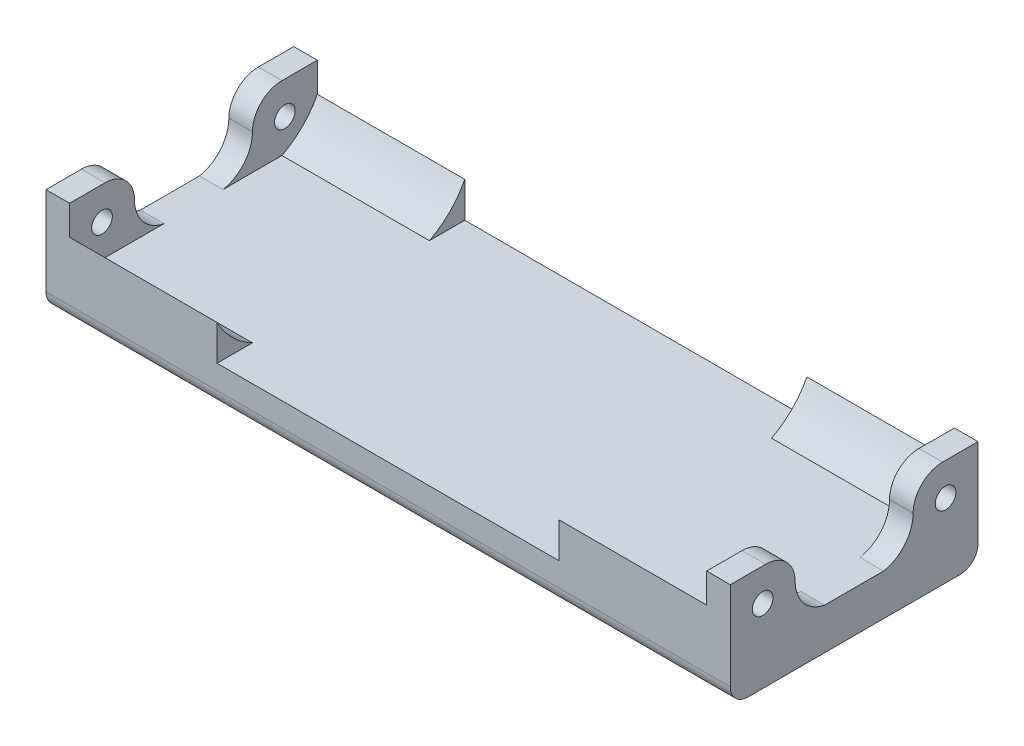
ISO-10303-21;
HEADER;
FILE_DESCRIPTION(('STEP AP214'),'2;1');
FILE_NAME('part.step','',(''),(''),'','','');
FILE_SCHEMA(('AUTOMOTIVE_DESIGN { 1 0 10303 214 1 1 1 1 }'));
ENDSEC;
DATA;
#1=APPLICATION_CONTEXT('core data for automotive mechanical design processes');
#2=APPLICATION_PROTOCOL_DEFINITION('international standard','automotive_design',2000,#1);
#3=PRODUCT_CONTEXT('',#1,'mechanical');
#4=PRODUCT('Part','Part','',(#3));
#5=PRODUCT_RELATED_PRODUCT_CATEGORY('part','',(#4));
#6=PRODUCT_DEFINITION_FORMATION('','',#4);
#7=PRODUCT_DEFINITION_CONTEXT('part definition',#1,'design');
#8=PRODUCT_DEFINITION('design','',#6,#7);
#9=PRODUCT_DEFINITION_SHAPE('','',#8);
#10=(LENGTH_UNIT() NAMED_UNIT(*) SI_UNIT(.MILLI.,.METRE.));
#11=(NAMED_UNIT(*) PLANE_ANGLE_UNIT() SI_UNIT($,.RADIAN.));
#12=(NAMED_UNIT(*) SI_UNIT($,.STERADIAN.) SOLID_ANGLE_UNIT());
#13=UNCERTAINTY_MEASURE_WITH_UNIT(LENGTH_MEASURE(1.E-05),#10,'distance_accuracy_value','');
#14=(GEOMETRIC_REPRESENTATION_CONTEXT(3) GLOBAL_UNCERTAINTY_ASSIGNED_CONTEXT((#13)) GLOBAL_UNIT_ASSIGNED_CONTEXT((#10,
#11,#12)) REPRESENTATION_CONTEXT('',''));
#15=CARTESIAN_POINT('',(0.,0.,0.));
#16=DIRECTION('',(0.,0.,1.));
#17=DIRECTION('',(1.,0.,0.));
#18=AXIS2_PLACEMENT_3D('',#15,#16,#17);
#19=CARTESIAN_POINT('',(0.,7.,0.));
#20=DIRECTION('',(0.,-1.,0.));
#21=DIRECTION('',(0.,0.,-1.));
#22=AXIS2_PLACEMENT_3D('',#19,#20,#21);
#23=PLANE('',#22);
#24=DIRECTION('',(0.,0.,-1.));
#25=VECTOR('',#24,1.);
#26=CARTESIAN_POINT('',(54.,7.,0.));
#27=LINE('',#26,#25);
#28=CARTESIAN_POINT('',(54.,7.,-4.99999999999997));
#29=VERTEX_POINT('',#28);
#30=CARTESIAN_POINT('',(54.,7.,-15.));
#31=VERTEX_POINT('',#30);
#32=EDGE_CURVE('E339',#29,#31,#27,.T.);
#33=ORIENTED_EDGE('',*,*,#32,.T.);
#34=DIRECTION('',(1.,0.,0.));
#35=VECTOR('',#34,1.);
#36=CARTESIAN_POINT('',(29.,7.,-15.));
#37=LINE('',#36,#35);
#38=CARTESIAN_POINT('',(29.,7.,-15.));
#39=VERTEX_POINT('',#38);
#40=EDGE_CURVE('E249',#39,#31,#37,.T.);
#41=ORIENTED_EDGE('',*,*,#40,.F.);
#42=DIRECTION('',(0.,0.,-1.));
#43=VECTOR('',#42,1.);
#44=CARTESIAN_POINT('',(29.,7.,-21.));
#45=LINE('',#44,#43);
#46=CARTESIAN_POINT('',(29.,7.,-21.));
#47=VERTEX_POINT('',#46);
#48=EDGE_CURVE('E255',#39,#47,#45,.T.);
#49=ORIENTED_EDGE('',*,*,#48,.T.);
#50=DIRECTION('',(1.,0.,0.));
#51=VECTOR('',#50,1.);
#52=CARTESIAN_POINT('',(-54.,7.,-21.));
#53=LINE('',#52,#51);
#54=CARTESIAN_POINT('',(-29.,7.,-21.));
#55=VERTEX_POINT('',#54);
#56=EDGE_CURVE('E262',#55,#47,#53,.T.);
#57=ORIENTED_EDGE('',*,*,#56,.F.);
#58=DIRECTION('',(0.,0.,-1.));
#59=VECTOR('',#58,1.);
#60=CARTESIAN_POINT('',(-29.,7.,-21.));
#61=LINE('',#60,#59);
#62=CARTESIAN_POINT('',(-29.,7.,-15.));
#63=VERTEX_POINT('',#62);
#64=EDGE_CURVE('E295',#63,#55,#61,.T.);
#65=ORIENTED_EDGE('',*,*,#64,.F.);
#66=DIRECTION('',(-1.,0.,0.));
#67=VECTOR('',#66,1.);
#68=CARTESIAN_POINT('',(-29.,7.,-15.));
#69=LINE('',#68,#67);
#70=CARTESIAN_POINT('',(-54.,7.,-15.));
#71=VERTEX_POINT('',#70);
#72=EDGE_CURVE('E283',#63,#71,#69,.T.);
#73=ORIENTED_EDGE('',*,*,#72,.T.);
#74=DIRECTION('',(0.,0.,-1.));
#75=VECTOR('',#74,1.);
#76=CARTESIAN_POINT('',(-54.,7.,0.));
#77=LINE('',#76,#75);
#78=CARTESIAN_POINT('',(-54.,7.,-4.99999999999997));
#79=VERTEX_POINT('',#78);
#80=EDGE_CURVE('E322',#79,#71,#77,.T.);
#81=ORIENTED_EDGE('',*,*,#80,.F.);
#82=DIRECTION('',(-1.,0.,0.));
#83=VECTOR('',#82,1.);
#84=CARTESIAN_POINT('',(77.4164878389476,7.,-4.99999999999997));
#85=LINE('',#84,#83);
#86=CARTESIAN_POINT('',(-58.,7.,-4.99999999999997));
#87=VERTEX_POINT('',#86);
#88=EDGE_CURVE('E447',#79,#87,#85,.T.);
#89=ORIENTED_EDGE('',*,*,#88,.T.);
#90=DIRECTION('',(0.,0.,1.));
#91=VECTOR('',#90,1.);
#92=CARTESIAN_POINT('',(-58.,7.,21.));
#93=LINE('',#92,#91);
#94=CARTESIAN_POINT('',(-58.,7.,4.99999999999998));
#95=VERTEX_POINT('',#94);
#96=EDGE_CURVE('E459',#87,#95,#93,.T.);
#97=ORIENTED_EDGE('',*,*,#96,.T.);
#98=DIRECTION('',(-1.,0.,0.));
#99=VECTOR('',#98,1.);
#100=CARTESIAN_POINT('',(77.4164878389476,7.,4.99999999999997));
#101=LINE('',#100,#99);
#102=CARTESIAN_POINT('',(-54.,7.,4.99999999999997));
#103=VERTEX_POINT('',#102);
#104=EDGE_CURVE('E403',#103,#95,#101,.T.);
#105=ORIENTED_EDGE('',*,*,#104,.F.);
#106=DIRECTION('',(0.,0.,-1.));
#107=VECTOR('',#106,1.);
#108=CARTESIAN_POINT('',(-54.,7.,0.));
#109=LINE('',#108,#107);
#110=CARTESIAN_POINT('',(-54.,7.,15.));
#111=VERTEX_POINT('',#110);
#112=EDGE_CURVE('E360',#111,#103,#109,.T.);
#113=ORIENTED_EDGE('',*,*,#112,.F.);
#114=DIRECTION('',(-1.,0.,0.));
#115=VECTOR('',#114,1.);
#116=CARTESIAN_POINT('',(-29.,7.,15.));
#117=LINE('',#116,#115);
#118=CARTESIAN_POINT('',(-29.,7.,15.));
#119=VERTEX_POINT('',#118);
#120=EDGE_CURVE('E310',#119,#111,#117,.T.);
#121=ORIENTED_EDGE('',*,*,#120,.F.);
#122=DIRECTION('',(0.,0.,-1.));
#123=VECTOR('',#122,1.);
#124=CARTESIAN_POINT('',(-29.,7.,21.));
#125=LINE('',#124,#123);
#126=CARTESIAN_POINT('',(-29.,7.,21.));
#127=VERTEX_POINT('',#126);
#128=EDGE_CURVE('E302',#127,#119,#125,.T.);
#129=ORIENTED_EDGE('',*,*,#128,.F.);
#130=DIRECTION('',(1.,0.,0.));
#131=VECTOR('',#130,1.);
#132=CARTESIAN_POINT('',(-54.,7.,21.));
#133=LINE('',#132,#131);
#134=CARTESIAN_POINT('',(29.,7.,21.));
#135=VERTEX_POINT('',#134);
#136=EDGE_CURVE('E333',#127,#135,#133,.T.);
#137=ORIENTED_EDGE('',*,*,#136,.T.);
#138=DIRECTION('',(0.,0.,-1.));
#139=VECTOR('',#138,1.);
#140=CARTESIAN_POINT('',(29.,7.,21.));
#141=LINE('',#140,#139);
#142=CARTESIAN_POINT('',(29.,7.,15.));
#143=VERTEX_POINT('',#142);
#144=EDGE_CURVE('E273',#135,#143,#141,.T.);
#145=ORIENTED_EDGE('',*,*,#144,.T.);
#146=DIRECTION('',(1.,0.,0.));
#147=VECTOR('',#146,1.);
#148=CARTESIAN_POINT('',(29.,7.,15.));
#149=LINE('',#148,#147);
#150=CARTESIAN_POINT('',(54.,7.,15.));
#151=VERTEX_POINT('',#150);
#152=EDGE_CURVE('E276',#143,#151,#149,.T.);
#153=ORIENTED_EDGE('',*,*,#152,.T.);
#154=DIRECTION('',(0.,0.,-1.));
#155=VECTOR('',#154,1.);
#156=CARTESIAN_POINT('',(54.,7.,0.));
#157=LINE('',#156,#155);
#158=CARTESIAN_POINT('',(54.,7.,4.99999999999997));
#159=VERTEX_POINT('',#158);
#160=EDGE_CURVE('E373',#151,#159,#157,.T.);
#161=ORIENTED_EDGE('',*,*,#160,.T.);
#162=CARTESIAN_POINT('',(58.,7.,4.99999999999998));
#163=VERTEX_POINT('',#162);
#164=EDGE_CURVE('E404',#163,#159,#101,.T.);
#165=ORIENTED_EDGE('',*,*,#164,.F.);
#166=DIRECTION('',(0.,0.,-1.));
#167=VECTOR('',#166,1.);
#168=CARTESIAN_POINT('',(58.,7.,21.));
#169=LINE('',#168,#167);
#170=CARTESIAN_POINT('',(58.,7.,-4.99999999999997));
#171=VERTEX_POINT('',#170);
#172=EDGE_CURVE('E457',#163,#171,#169,.T.);
#173=ORIENTED_EDGE('',*,*,#172,.T.);
#174=EDGE_CURVE('E448',#171,#29,#85,.T.);
#175=ORIENTED_EDGE('',*,*,#174,.T.);
#176=EDGE_LOOP('',(#33,#41,#49,#57,#65,#73,#81,#89,#97,#105,#113,#121,#129,#137,#145,#153,#161,
#165,#173,#175));
#177=FACE_BOUND('',#176,.T.);
#178=ADVANCED_FACE('F40',(#177),#23,.F.);
#179=CARTESIAN_POINT('',(-54.,0.,0.));
#180=DIRECTION('',(1.,0.,0.));
#181=DIRECTION('',(0.,0.,-1.));
#182=AXIS2_PLACEMENT_3D('',#179,#180,#181);
#183=PLANE('',#182);
#184=CARTESIAN_POINT('',(-54.,12.4749999999999,-15.5));
#185=DIRECTION('',(1.,0.,0.));
#186=DIRECTION('',(0.,0.,-1.));
#187=AXIS2_PLACEMENT_3D('',#184,#185,#186);
#188=CIRCLE('',#187,1.74999999999998);
#189=CARTESIAN_POINT('',(-54.,12.4749999999999,-17.2499999999999));
#190=VERTEX_POINT('',#189);
#191=EDGE_CURVE('E313',#190,#190,#188,.T.);
#192=ORIENTED_EDGE('',*,*,#191,.F.);
#193=EDGE_LOOP('',(#192));
#194=FACE_BOUND('',#193,.T.);
#195=ORIENTED_EDGE('',*,*,#80,.T.);
#196=CARTESIAN_POINT('',(-54.,19.4339811320566,-8.5660188679434));
#197=DIRECTION('',(-1.,0.,0.));
#198=DIRECTION('',(0.,0.,-1.));
#199=AXIS2_PLACEMENT_3D('',#196,#197,#198);
#200=CIRCLE('',#199,14.);
#201=CARTESIAN_POINT('',(-54.,13.,-21.));
#202=VERTEX_POINT('',#201);
#203=EDGE_CURVE('E289',#202,#71,#200,.T.);
#204=ORIENTED_EDGE('',*,*,#203,.F.);
#205=DIRECTION('',(0.,1.,0.));
#206=VECTOR('',#205,1.);
#207=CARTESIAN_POINT('',(-54.,0.,-21.));
#208=LINE('',#207,#206);
#209=CARTESIAN_POINT('',(-54.,18.,-21.));
#210=VERTEX_POINT('',#209);
#211=EDGE_CURVE('E325',#202,#210,#208,.T.);
#212=ORIENTED_EDGE('',*,*,#211,.T.);
#213=DIRECTION('',(0.,0.,1.));
#214=VECTOR('',#213,1.);
#215=CARTESIAN_POINT('',(-54.,18.,0.));
#216=LINE('',#215,#214);
#217=CARTESIAN_POINT('',(-54.,18.,-15.));
#218=VERTEX_POINT('',#217);
#219=EDGE_CURVE('E327',#210,#218,#216,.T.);
#220=ORIENTED_EDGE('',*,*,#219,.T.);
#221=CARTESIAN_POINT('',(-54.,13.,-15.));
#222=DIRECTION('',(1.,0.,0.));
#223=DIRECTION('',(0.,0.,-1.));
#224=AXIS2_PLACEMENT_3D('',#221,#222,#223);
#225=CIRCLE('',#224,5.);
#226=CARTESIAN_POINT('',(-54.,13.,-10.));
#227=VERTEX_POINT('',#226);
#228=EDGE_CURVE('E316',#218,#227,#225,.T.);
#229=ORIENTED_EDGE('',*,*,#228,.T.);
#230=CARTESIAN_POINT('',(-54.,13.,-3.90000000000004));
#231=DIRECTION('',(1.,0.,0.));
#232=DIRECTION('',(0.,0.,-1.));
#233=AXIS2_PLACEMENT_3D('',#230,#231,#232);
#234=CIRCLE('',#233,6.09999999999996);
#235=EDGE_CURVE('E319',#227,#79,#234,.F.);
#236=ORIENTED_EDGE('',*,*,#235,.T.);
#237=EDGE_LOOP('',(#195,#204,#212,#220,#229,#236));
#238=FACE_BOUND('',#237,.T.);
#239=ADVANCED_FACE('F593',(#194,#238),#183,.T.);
#240=CARTESIAN_POINT('',(-54.,0.,0.));
#241=DIRECTION('',(1.,0.,0.));
#242=DIRECTION('',(0.,0.,-1.));
#243=AXIS2_PLACEMENT_3D('',#240,#241,#242);
#244=PLANE('',#243);
#245=CARTESIAN_POINT('',(-54.,12.4749999999999,15.5));
#246=DIRECTION('',(1.,0.,0.));
#247=DIRECTION('',(0.,0.,-1.));
#248=AXIS2_PLACEMENT_3D('',#245,#246,#247);
#249=CIRCLE('',#248,1.74999999999999);
#250=CARTESIAN_POINT('',(-54.,12.4749999999999,13.75));
#251=VERTEX_POINT('',#250);
#252=EDGE_CURVE('E348',#251,#251,#249,.T.);
#253=ORIENTED_EDGE('',*,*,#252,.F.);
#254=EDGE_LOOP('',(#253));
#255=FACE_BOUND('',#254,.T.);
#256=DIRECTION('',(0.,1.,0.));
#257=VECTOR('',#256,1.);
#258=CARTESIAN_POINT('',(-54.,0.,21.));
#259=LINE('',#258,#257);
#260=CARTESIAN_POINT('',(-54.,13.,21.));
#261=VERTEX_POINT('',#260);
#262=CARTESIAN_POINT('',(-54.,18.,21.));
#263=VERTEX_POINT('',#262);
#264=EDGE_CURVE('E358',#261,#263,#259,.T.);
#265=ORIENTED_EDGE('',*,*,#264,.F.);
#266=CARTESIAN_POINT('',(-54.,19.4339811320566,8.5660188679434));
#267=DIRECTION('',(-1.,0.,0.));
#268=DIRECTION('',(0.,0.,1.));
#269=AXIS2_PLACEMENT_3D('',#266,#267,#268);
#270=CIRCLE('',#269,14.);
#271=EDGE_CURVE('E292',#111,#261,#270,.T.);
#272=ORIENTED_EDGE('',*,*,#271,.F.);
#273=ORIENTED_EDGE('',*,*,#112,.T.);
#274=CARTESIAN_POINT('',(-54.,13.,3.90000000000004));
#275=DIRECTION('',(1.,0.,0.));
#276=DIRECTION('',(0.,0.,-1.));
#277=AXIS2_PLACEMENT_3D('',#274,#275,#276);
#278=CIRCLE('',#277,6.09999999999996);
#279=CARTESIAN_POINT('',(-54.,13.,10.));
#280=VERTEX_POINT('',#279);
#281=EDGE_CURVE('E362',#280,#103,#278,.T.);
#282=ORIENTED_EDGE('',*,*,#281,.F.);
#283=CARTESIAN_POINT('',(-54.,13.,15.));
#284=DIRECTION('',(1.,0.,0.));
#285=DIRECTION('',(0.,0.,-1.));
#286=AXIS2_PLACEMENT_3D('',#283,#284,#285);
#287=CIRCLE('',#286,5.);
#288=CARTESIAN_POINT('',(-54.,18.,15.));
#289=VERTEX_POINT('',#288);
#290=EDGE_CURVE('E351',#289,#280,#287,.F.);
#291=ORIENTED_EDGE('',*,*,#290,.F.);
#292=DIRECTION('',(0.,0.,-1.));
#293=VECTOR('',#292,1.);
#294=CARTESIAN_POINT('',(-54.,18.,0.));
#295=LINE('',#294,#293);
#296=EDGE_CURVE('E355',#263,#289,#295,.T.);
#297=ORIENTED_EDGE('',*,*,#296,.F.);
#298=EDGE_LOOP('',(#265,#272,#273,#282,#291,#297));
#299=FACE_BOUND('',#298,.T.);
#300=ADVANCED_FACE('F560',(#255,#299),#244,.T.);
#301=CARTESIAN_POINT('',(-58.,7.,-21.));
#302=DIRECTION('',(0.,0.,1.));
#303=DIRECTION('',(1.,0.,0.));
#304=AXIS2_PLACEMENT_3D('',#301,#302,#303);
#305=PLANE('',#304);
#306=DIRECTION('',(0.,-1.,0.));
#307=VECTOR('',#306,1.);
#308=CARTESIAN_POINT('',(58.,7.,-21.));
#309=LINE('',#308,#307);
#310=CARTESIAN_POINT('',(58.,18.,-21.));
#311=VERTEX_POINT('',#310);
#312=CARTESIAN_POINT('',(58.,3.,-21.));
#313=VERTEX_POINT('',#312);
#314=EDGE_CURVE('E475',#311,#313,#309,.T.);
#315=ORIENTED_EDGE('',*,*,#314,.T.);
#316=DIRECTION('',(-1.,0.,0.));
#317=VECTOR('',#316,1.);
#318=CARTESIAN_POINT('',(-58.,3.,-21.));
#319=LINE('',#318,#317);
#320=CARTESIAN_POINT('',(-58.,3.,-21.));
#321=VERTEX_POINT('',#320);
#322=EDGE_CURVE('E11',#313,#321,#319,.T.);
#323=ORIENTED_EDGE('',*,*,#322,.T.);
#324=DIRECTION('',(0.,-1.,0.));
#325=VECTOR('',#324,1.);
#326=CARTESIAN_POINT('',(-58.,7.,-21.));
#327=LINE('',#326,#325);
#328=CARTESIAN_POINT('',(-58.,18.,-21.));
#329=VERTEX_POINT('',#328);
#330=EDGE_CURVE('E472',#329,#321,#327,.T.);
#331=ORIENTED_EDGE('',*,*,#330,.F.);
#332=DIRECTION('',(-1.,0.,0.));
#333=VECTOR('',#332,1.);
#334=CARTESIAN_POINT('',(77.4164878389476,18.,-21.));
#335=LINE('',#334,#333);
#336=EDGE_CURVE('E443',#210,#329,#335,.T.);
#337=ORIENTED_EDGE('',*,*,#336,.F.);
#338=ORIENTED_EDGE('',*,*,#211,.F.);
#339=DIRECTION('',(-1.,0.,0.));
#340=VECTOR('',#339,1.);
#341=CARTESIAN_POINT('',(-29.,13.,-21.));
#342=LINE('',#341,#340);
#343=CARTESIAN_POINT('',(-29.,13.,-21.));
#344=VERTEX_POINT('',#343);
#345=EDGE_CURVE('E285',#344,#202,#342,.T.);
#346=ORIENTED_EDGE('',*,*,#345,.F.);
#347=DIRECTION('',(0.,1.,0.));
#348=VECTOR('',#347,1.);
#349=CARTESIAN_POINT('',(-29.,7.,-21.));
#350=LINE('',#349,#348);
#351=EDGE_CURVE('E288',#55,#344,#350,.T.);
#352=ORIENTED_EDGE('',*,*,#351,.F.);
#353=ORIENTED_EDGE('',*,*,#56,.T.);
#354=DIRECTION('',(0.,1.,0.));
#355=VECTOR('',#354,1.);
#356=CARTESIAN_POINT('',(29.,7.,-21.));
#357=LINE('',#356,#355);
#358=CARTESIAN_POINT('',(29.,13.,-21.));
#359=VERTEX_POINT('',#358);
#360=EDGE_CURVE('E253',#47,#359,#357,.T.);
#361=ORIENTED_EDGE('',*,*,#360,.T.);
#362=DIRECTION('',(1.,0.,0.));
#363=VECTOR('',#362,1.);
#364=CARTESIAN_POINT('',(29.,13.,-21.));
#365=LINE('',#364,#363);
#366=CARTESIAN_POINT('',(54.,13.,-21.));
#367=VERTEX_POINT('',#366);
#368=EDGE_CURVE('E238',#359,#367,#365,.T.);
#369=ORIENTED_EDGE('',*,*,#368,.T.);
#370=DIRECTION('',(0.,1.,0.));
#371=VECTOR('',#370,1.);
#372=CARTESIAN_POINT('',(54.,0.,-21.));
#373=LINE('',#372,#371);
#374=CARTESIAN_POINT('',(54.,18.,-21.));
#375=VERTEX_POINT('',#374);
#376=EDGE_CURVE('E342',#367,#375,#373,.T.);
#377=ORIENTED_EDGE('',*,*,#376,.T.);
#378=EDGE_CURVE('E444',#311,#375,#335,.T.);
#379=ORIENTED_EDGE('',*,*,#378,.F.);
#380=EDGE_LOOP('',(#315,#323,#331,#337,#338,#346,#352,#353,#361,#369,#377,#379));
#381=FACE_BOUND('',#380,.T.);
#382=ADVANCED_FACE('F260',(#381),#305,.F.);
#383=CARTESIAN_POINT('',(-58.,7.,21.));
#384=DIRECTION('',(0.,0.,-1.));
#385=DIRECTION('',(-1.,0.,0.));
#386=AXIS2_PLACEMENT_3D('',#383,#384,#385);
#387=PLANE('',#386);
#388=DIRECTION('',(0.,-1.,0.));
#389=VECTOR('',#388,1.);
#390=CARTESIAN_POINT('',(-58.,7.,21.));
#391=LINE('',#390,#389);
#392=CARTESIAN_POINT('',(-58.,18.,21.));
#393=VERTEX_POINT('',#392);
#394=CARTESIAN_POINT('',(-58.,3.,21.));
#395=VERTEX_POINT('',#394);
#396=EDGE_CURVE('E469',#393,#395,#391,.T.);
#397=ORIENTED_EDGE('',*,*,#396,.T.);
#398=DIRECTION('',(1.,0.,0.));
#399=VECTOR('',#398,1.);
#400=CARTESIAN_POINT('',(58.,3.,21.));
#401=LINE('',#400,#399);
#402=CARTESIAN_POINT('',(58.,3.,21.));
#403=VERTEX_POINT('',#402);
#404=EDGE_CURVE('E477',#395,#403,#401,.T.);
#405=ORIENTED_EDGE('',*,*,#404,.T.);
#406=DIRECTION('',(0.,-1.,0.));
#407=VECTOR('',#406,1.);
#408=CARTESIAN_POINT('',(58.,7.,21.));
#409=LINE('',#408,#407);
#410=CARTESIAN_POINT('',(58.,18.,21.));
#411=VERTEX_POINT('',#410);
#412=EDGE_CURVE('E463',#411,#403,#409,.T.);
#413=ORIENTED_EDGE('',*,*,#412,.F.);
#414=DIRECTION('',(-1.,0.,0.));
#415=VECTOR('',#414,1.);
#416=CARTESIAN_POINT('',(77.4164878389476,18.,21.));
#417=LINE('',#416,#415);
#418=CARTESIAN_POINT('',(54.,18.,21.));
#419=VERTEX_POINT('',#418);
#420=EDGE_CURVE('E400',#411,#419,#417,.T.);
#421=ORIENTED_EDGE('',*,*,#420,.T.);
#422=DIRECTION('',(0.,1.,0.));
#423=VECTOR('',#422,1.);
#424=CARTESIAN_POINT('',(54.,0.,21.));
#425=LINE('',#424,#423);
#426=CARTESIAN_POINT('',(54.,13.,21.));
#427=VERTEX_POINT('',#426);
#428=EDGE_CURVE('E371',#427,#419,#425,.T.);
#429=ORIENTED_EDGE('',*,*,#428,.F.);
#430=DIRECTION('',(1.,0.,0.));
#431=VECTOR('',#430,1.);
#432=CARTESIAN_POINT('',(29.,13.,21.));
#433=LINE('',#432,#431);
#434=CARTESIAN_POINT('',(29.,13.,21.));
#435=VERTEX_POINT('',#434);
#436=EDGE_CURVE('E281',#435,#427,#433,.T.);
#437=ORIENTED_EDGE('',*,*,#436,.F.);
#438=DIRECTION('',(0.,-1.,0.));
#439=VECTOR('',#438,1.);
#440=CARTESIAN_POINT('',(29.,7.,21.));
#441=LINE('',#440,#439);
#442=EDGE_CURVE('E268',#435,#135,#441,.T.);
#443=ORIENTED_EDGE('',*,*,#442,.T.);
#444=ORIENTED_EDGE('',*,*,#136,.F.);
#445=DIRECTION('',(0.,-1.,0.));
#446=VECTOR('',#445,1.);
#447=CARTESIAN_POINT('',(-29.,7.,21.));
#448=LINE('',#447,#446);
#449=CARTESIAN_POINT('',(-29.,13.,21.));
#450=VERTEX_POINT('',#449);
#451=EDGE_CURVE('E300',#450,#127,#448,.T.);
#452=ORIENTED_EDGE('',*,*,#451,.F.);
#453=DIRECTION('',(-1.,0.,0.));
#454=VECTOR('',#453,1.);
#455=CARTESIAN_POINT('',(-29.,13.,21.));
#456=LINE('',#455,#454);
#457=EDGE_CURVE('E306',#450,#261,#456,.T.);
#458=ORIENTED_EDGE('',*,*,#457,.T.);
#459=ORIENTED_EDGE('',*,*,#264,.T.);
#460=EDGE_CURVE('E398',#263,#393,#417,.T.);
#461=ORIENTED_EDGE('',*,*,#460,.T.);
#462=EDGE_LOOP('',(#397,#405,#413,#421,#429,#437,#443,#444,#452,#458,#459,#461));
#463=FACE_BOUND('',#462,.T.);
#464=ADVANCED_FACE('F496',(#463),#387,.F.);
#465=CARTESIAN_POINT('',(77.4164878389476,12.4749999999999,-15.5));
#466=DIRECTION('',(-1.,0.,0.));
#467=DIRECTION('',(0.,0.,1.));
#468=AXIS2_PLACEMENT_3D('',#465,#466,#467);
#469=CYLINDRICAL_SURFACE('',#468,1.74999999999998);
#470=CARTESIAN_POINT('',(-58.,12.4749999999999,-15.5));
#471=DIRECTION('',(1.,0.,0.));
#472=DIRECTION('',(0.,0.,-1.));
#473=AXIS2_PLACEMENT_3D('',#470,#471,#472);
#474=CIRCLE('',#473,1.74999999999998);
#475=CARTESIAN_POINT('',(-58.,12.4749999999999,-17.2499999999999));
#476=VERTEX_POINT('',#475);
#477=EDGE_CURVE('E393',#476,#476,#474,.F.);
#478=ORIENTED_EDGE('',*,*,#477,.T.);
#479=EDGE_LOOP('',(#478));
#480=FACE_BOUND('',#479,.T.);
#481=ORIENTED_EDGE('',*,*,#191,.T.);
#482=EDGE_LOOP('',(#481));
#483=FACE_BOUND('',#482,.T.);
#484=ADVANCED_FACE('F627',(#480,#483),#469,.F.);
#485=CARTESIAN_POINT('',(77.4164878389476,18.,0.));
#486=DIRECTION('',(0.,-1.,0.));
#487=DIRECTION('',(0.,0.,-1.));
#488=AXIS2_PLACEMENT_3D('',#485,#486,#487);
#489=PLANE('',#488);
#490=ORIENTED_EDGE('',*,*,#219,.F.);
#491=ORIENTED_EDGE('',*,*,#336,.T.);
#492=DIRECTION('',(0.,0.,-1.));
#493=VECTOR('',#492,1.);
#494=CARTESIAN_POINT('',(-58.,18.,0.));
#495=LINE('',#494,#493);
#496=CARTESIAN_POINT('',(-58.,18.,-15.));
#497=VERTEX_POINT('',#496);
#498=EDGE_CURVE('E424',#497,#329,#495,.T.);
#499=ORIENTED_EDGE('',*,*,#498,.F.);
#500=DIRECTION('',(-1.,0.,0.));
#501=VECTOR('',#500,1.);
#502=CARTESIAN_POINT('',(77.4164878389476,18.,-15.));
#503=LINE('',#502,#501);
#504=EDGE_CURVE('E423',#218,#497,#503,.T.);
#505=ORIENTED_EDGE('',*,*,#504,.F.);
#506=EDGE_LOOP('',(#490,#491,#499,#505));
#507=FACE_BOUND('',#506,.T.);
#508=ADVANCED_FACE('F587',(#507),#489,.F.);
#509=CARTESIAN_POINT('',(77.4164878389476,13.,-3.90000000000004));
#510=DIRECTION('',(-1.,0.,0.));
#511=DIRECTION('',(0.,0.,1.));
#512=AXIS2_PLACEMENT_3D('',#509,#510,#511);
#513=CYLINDRICAL_SURFACE('',#512,6.09999999999996);
#514=ORIENTED_EDGE('',*,*,#235,.F.);
#515=DIRECTION('',(-1.,0.,0.));
#516=VECTOR('',#515,1.);
#517=CARTESIAN_POINT('',(77.4164878389476,13.,-10.));
#518=LINE('',#517,#516);
#519=CARTESIAN_POINT('',(-58.,13.,-10.));
#520=VERTEX_POINT('',#519);
#521=EDGE_CURVE('E451',#227,#520,#518,.T.);
#522=ORIENTED_EDGE('',*,*,#521,.T.);
#523=CARTESIAN_POINT('',(-58.,13.,-3.90000000000004));
#524=DIRECTION('',(1.,0.,0.));
#525=DIRECTION('',(0.,0.,-1.));
#526=AXIS2_PLACEMENT_3D('',#523,#524,#525);
#527=CIRCLE('',#526,6.09999999999996);
#528=EDGE_CURVE('E420',#87,#520,#527,.T.);
#529=ORIENTED_EDGE('',*,*,#528,.F.);
#530=ORIENTED_EDGE('',*,*,#88,.F.);
#531=EDGE_LOOP('',(#514,#522,#529,#530));
#532=FACE_BOUND('',#531,.T.);
#533=ADVANCED_FACE('F578',(#532),#513,.F.);
#534=CARTESIAN_POINT('',(77.4164878389476,13.,-15.));
#535=DIRECTION('',(-1.,0.,0.));
#536=DIRECTION('',(0.,0.,1.));
#537=AXIS2_PLACEMENT_3D('',#534,#535,#536);
#538=CYLINDRICAL_SURFACE('',#537,5.);
#539=ORIENTED_EDGE('',*,*,#228,.F.);
#540=ORIENTED_EDGE('',*,*,#504,.T.);
#541=CARTESIAN_POINT('',(-58.,13.,-15.));
#542=DIRECTION('',(1.,0.,0.));
#543=DIRECTION('',(0.,0.,-1.));
#544=AXIS2_PLACEMENT_3D('',#541,#542,#543);
#545=CIRCLE('',#544,5.);
#546=EDGE_CURVE('E419',#520,#497,#545,.F.);
#547=ORIENTED_EDGE('',*,*,#546,.F.);
#548=ORIENTED_EDGE('',*,*,#521,.F.);
#549=EDGE_LOOP('',(#539,#540,#547,#548));
#550=FACE_BOUND('',#549,.T.);
#551=ADVANCED_FACE('F582',(#550),#538,.T.);
#552=CARTESIAN_POINT('',(77.4164878389476,13.,15.));
#553=DIRECTION('',(-1.,0.,0.));
#554=DIRECTION('',(0.,0.,1.));
#555=AXIS2_PLACEMENT_3D('',#552,#553,#554);
#556=CYLINDRICAL_SURFACE('',#555,5.);
#557=DIRECTION('',(-1.,0.,0.));
#558=VECTOR('',#557,1.);
#559=CARTESIAN_POINT('',(77.4164878389476,18.,15.));
#560=LINE('',#559,#558);
#561=CARTESIAN_POINT('',(-58.,18.,15.));
#562=VERTEX_POINT('',#561);
#563=EDGE_CURVE('E399',#289,#562,#560,.T.);
#564=ORIENTED_EDGE('',*,*,#563,.F.);
#565=ORIENTED_EDGE('',*,*,#290,.T.);
#566=DIRECTION('',(-1.,0.,0.));
#567=VECTOR('',#566,1.);
#568=CARTESIAN_POINT('',(77.4164878389476,13.,10.));
#569=LINE('',#568,#567);
#570=CARTESIAN_POINT('',(-58.,13.,10.));
#571=VERTEX_POINT('',#570);
#572=EDGE_CURVE('E388',#280,#571,#569,.T.);
#573=ORIENTED_EDGE('',*,*,#572,.T.);
#574=CARTESIAN_POINT('',(-58.,13.,15.));
#575=DIRECTION('',(1.,0.,0.));
#576=DIRECTION('',(0.,0.,-1.));
#577=AXIS2_PLACEMENT_3D('',#574,#575,#576);
#578=CIRCLE('',#577,5.);
#579=EDGE_CURVE('E382',#571,#562,#578,.T.);
#580=ORIENTED_EDGE('',*,*,#579,.T.);
#581=EDGE_LOOP('',(#564,#565,#573,#580));
#582=FACE_BOUND('',#581,.T.);
#583=ADVANCED_FACE('F568',(#582),#556,.T.);
#584=CARTESIAN_POINT('',(77.4164878389476,18.,0.));
#585=DIRECTION('',(0.,1.,0.));
#586=DIRECTION('',(0.,0.,1.));
#587=AXIS2_PLACEMENT_3D('',#584,#585,#586);
#588=PLANE('',#587);
#589=ORIENTED_EDGE('',*,*,#460,.F.);
#590=ORIENTED_EDGE('',*,*,#296,.T.);
#591=ORIENTED_EDGE('',*,*,#563,.T.);
#592=DIRECTION('',(0.,0.,1.));
#593=VECTOR('',#592,1.);
#594=CARTESIAN_POINT('',(-58.,18.,0.));
#595=LINE('',#594,#593);
#596=EDGE_CURVE('E347',#562,#393,#595,.T.);
#597=ORIENTED_EDGE('',*,*,#596,.T.);
#598=EDGE_LOOP('',(#589,#590,#591,#597));
#599=FACE_BOUND('',#598,.T.);
#600=ADVANCED_FACE('F564',(#599),#588,.T.);
#601=CARTESIAN_POINT('',(77.4164878389476,12.4749999999999,15.5));
#602=DIRECTION('',(-1.,0.,0.));
#603=DIRECTION('',(0.,0.,1.));
#604=AXIS2_PLACEMENT_3D('',#601,#602,#603);
#605=CYLINDRICAL_SURFACE('',#604,1.74999999999999);
#606=CARTESIAN_POINT('',(-58.,12.4749999999999,15.5));
#607=DIRECTION('',(1.,0.,0.));
#608=DIRECTION('',(0.,0.,-1.));
#609=AXIS2_PLACEMENT_3D('',#606,#607,#608);
#610=CIRCLE('',#609,1.74999999999999);
#611=CARTESIAN_POINT('',(-58.,12.4749999999999,13.75));
#612=VERTEX_POINT('',#611);
#613=EDGE_CURVE('E385',#612,#612,#610,.F.);
#614=ORIENTED_EDGE('',*,*,#613,.T.);
#615=EDGE_LOOP('',(#614));
#616=FACE_BOUND('',#615,.T.);
#617=ORIENTED_EDGE('',*,*,#252,.T.);
#618=EDGE_LOOP('',(#617));
#619=FACE_BOUND('',#618,.T.);
#620=ADVANCED_FACE('F848',(#616,#619),#605,.F.);
#621=CARTESIAN_POINT('',(77.4164878389476,13.,3.90000000000004));
#622=DIRECTION('',(-1.,0.,0.));
#623=DIRECTION('',(0.,0.,1.));
#624=AXIS2_PLACEMENT_3D('',#621,#622,#623);
#625=CYLINDRICAL_SURFACE('',#624,6.09999999999996);
#626=ORIENTED_EDGE('',*,*,#572,.F.);
#627=ORIENTED_EDGE('',*,*,#281,.T.);
#628=ORIENTED_EDGE('',*,*,#104,.T.);
#629=CARTESIAN_POINT('',(-58.,13.,3.90000000000004));
#630=DIRECTION('',(1.,0.,0.));
#631=DIRECTION('',(0.,0.,-1.));
#632=AXIS2_PLACEMENT_3D('',#629,#630,#631);
#633=CIRCLE('',#632,6.09999999999996);
#634=EDGE_CURVE('E379',#95,#571,#633,.F.);
#635=ORIENTED_EDGE('',*,*,#634,.T.);
#636=EDGE_LOOP('',(#626,#627,#628,#635));
#637=FACE_BOUND('',#636,.T.);
#638=ADVANCED_FACE('F571',(#637),#625,.F.);
#639=CARTESIAN_POINT('',(58.,7.,21.));
#640=DIRECTION('',(-1.,0.,0.));
#641=DIRECTION('',(0.,0.,1.));
#642=AXIS2_PLACEMENT_3D('',#639,#640,#641);
#643=PLANE('',#642);
#644=ORIENTED_EDGE('',*,*,#412,.T.);
#645=CARTESIAN_POINT('',(58.,3.,18.));
#646=DIRECTION('',(-1.,0.,0.));
#647=DIRECTION('',(0.,0.,1.));
#648=AXIS2_PLACEMENT_3D('',#645,#646,#647);
#649=CIRCLE('',#648,3.);
#650=CARTESIAN_POINT('',(58.,0.,18.));
#651=VERTEX_POINT('',#650);
#652=EDGE_CURVE('E482',#403,#651,#649,.F.);
#653=ORIENTED_EDGE('',*,*,#652,.T.);
#654=DIRECTION('',(0.,0.,-1.));
#655=VECTOR('',#654,1.);
#656=CARTESIAN_POINT('',(58.,0.,21.));
#657=LINE('',#656,#655);
#658=CARTESIAN_POINT('',(58.,0.,-18.));
#659=VERTEX_POINT('',#658);
#660=EDGE_CURVE('E439',#651,#659,#657,.T.);
#661=ORIENTED_EDGE('',*,*,#660,.T.);
#662=CARTESIAN_POINT('',(58.,3.,-18.));
#663=DIRECTION('',(-1.,0.,0.));
#664=DIRECTION('',(0.,0.,1.));
#665=AXIS2_PLACEMENT_3D('',#662,#663,#664);
#666=CIRCLE('',#665,3.);
#667=EDGE_CURVE('E480',#659,#313,#666,.F.);
#668=ORIENTED_EDGE('',*,*,#667,.T.);
#669=ORIENTED_EDGE('',*,*,#314,.F.);
#670=DIRECTION('',(0.,0.,-1.));
#671=VECTOR('',#670,1.);
#672=CARTESIAN_POINT('',(58.,18.,0.));
#673=LINE('',#672,#671);
#674=CARTESIAN_POINT('',(58.,18.,-15.));
#675=VERTEX_POINT('',#674);
#676=EDGE_CURVE('E433',#675,#311,#673,.T.);
#677=ORIENTED_EDGE('',*,*,#676,.F.);
#678=CARTESIAN_POINT('',(58.,13.,-15.));
#679=DIRECTION('',(-1.,0.,0.));
#680=DIRECTION('',(0.,0.,1.));
#681=AXIS2_PLACEMENT_3D('',#678,#679,#680);
#682=CIRCLE('',#681,5.);
#683=CARTESIAN_POINT('',(58.,13.,-10.));
#684=VERTEX_POINT('',#683);
#685=EDGE_CURVE('E432',#684,#675,#682,.T.);
#686=ORIENTED_EDGE('',*,*,#685,.F.);
#687=CARTESIAN_POINT('',(58.,13.,-3.90000000000004));
#688=DIRECTION('',(-1.,0.,0.));
#689=DIRECTION('',(0.,0.,1.));
#690=AXIS2_PLACEMENT_3D('',#687,#688,#689);
#691=CIRCLE('',#690,6.09999999999996);
#692=EDGE_CURVE('E429',#171,#684,#691,.F.);
#693=ORIENTED_EDGE('',*,*,#692,.F.);
#694=ORIENTED_EDGE('',*,*,#172,.F.);
#695=CARTESIAN_POINT('',(58.,13.,3.90000000000004));
#696=DIRECTION('',(-1.,0.,0.));
#697=DIRECTION('',(0.,0.,1.));
#698=AXIS2_PLACEMENT_3D('',#695,#696,#697);
#699=CIRCLE('',#698,6.09999999999996);
#700=CARTESIAN_POINT('',(58.,13.,10.));
#701=VERTEX_POINT('',#700);
#702=EDGE_CURVE('E391',#163,#701,#699,.T.);
#703=ORIENTED_EDGE('',*,*,#702,.T.);
#704=CARTESIAN_POINT('',(58.,13.,15.));
#705=DIRECTION('',(-1.,0.,0.));
#706=DIRECTION('',(0.,0.,1.));
#707=AXIS2_PLACEMENT_3D('',#704,#705,#706);
#708=CIRCLE('',#707,5.);
#709=CARTESIAN_POINT('',(58.,18.,15.));
#710=VERTEX_POINT('',#709);
#711=EDGE_CURVE('E413',#701,#710,#708,.F.);
#712=ORIENTED_EDGE('',*,*,#711,.T.);
#713=DIRECTION('',(0.,0.,1.));
#714=VECTOR('',#713,1.);
#715=CARTESIAN_POINT('',(58.,18.,0.));
#716=LINE('',#715,#714);
#717=EDGE_CURVE('E394',#710,#411,#716,.T.);
#718=ORIENTED_EDGE('',*,*,#717,.T.);
#719=EDGE_LOOP('',(#644,#653,#661,#668,#669,#677,#686,#693,#694,#703,#712,#718));
#720=FACE_BOUND('',#719,.T.);
#721=CARTESIAN_POINT('',(58.,12.4749999999999,-15.5));
#722=DIRECTION('',(-1.,0.,0.));
#723=DIRECTION('',(0.,0.,1.));
#724=AXIS2_PLACEMENT_3D('',#721,#722,#723);
#725=CIRCLE('',#724,1.74999999999998);
#726=CARTESIAN_POINT('',(58.,12.4749999999999,-13.75));
#727=VERTEX_POINT('',#726);
#728=EDGE_CURVE('E436',#727,#727,#725,.T.);
#729=ORIENTED_EDGE('',*,*,#728,.T.);
#730=EDGE_LOOP('',(#729));
#731=FACE_BOUND('',#730,.T.);
#732=CARTESIAN_POINT('',(58.,12.4749999999999,15.5));
#733=DIRECTION('',(-1.,0.,0.));
#734=DIRECTION('',(0.,0.,1.));
#735=AXIS2_PLACEMENT_3D('',#732,#733,#734);
#736=CIRCLE('',#735,1.74999999999999);
#737=CARTESIAN_POINT('',(58.,12.4749999999999,17.25));
#738=VERTEX_POINT('',#737);
#739=EDGE_CURVE('E407',#738,#738,#736,.T.);
#740=ORIENTED_EDGE('',*,*,#739,.T.);
#741=EDGE_LOOP('',(#740));
#742=FACE_BOUND('',#741,.T.);
#743=ADVANCED_FACE('F500',(#720,#731,#742),#643,.F.);
#744=CARTESIAN_POINT('',(-58.,7.,21.));
#745=DIRECTION('',(1.,0.,0.));
#746=DIRECTION('',(0.,0.,-1.));
#747=AXIS2_PLACEMENT_3D('',#744,#745,#746);
#748=PLANE('',#747);
#749=DIRECTION('',(0.,0.,1.));
#750=VECTOR('',#749,1.);
#751=CARTESIAN_POINT('',(-58.,0.,21.));
#752=LINE('',#751,#750);
#753=CARTESIAN_POINT('',(-58.,0.,-18.));
#754=VERTEX_POINT('',#753);
#755=CARTESIAN_POINT('',(-58.,0.,18.));
#756=VERTEX_POINT('',#755);
#757=EDGE_CURVE('E460',#754,#756,#752,.T.);
#758=ORIENTED_EDGE('',*,*,#757,.T.);
#759=CARTESIAN_POINT('',(-58.,3.,18.));
#760=DIRECTION('',(1.,0.,0.));
#761=DIRECTION('',(0.,0.,-1.));
#762=AXIS2_PLACEMENT_3D('',#759,#760,#761);
#763=CIRCLE('',#762,3.);
#764=EDGE_CURVE('E48',#756,#395,#763,.F.);
#765=ORIENTED_EDGE('',*,*,#764,.T.);
#766=ORIENTED_EDGE('',*,*,#396,.F.);
#767=ORIENTED_EDGE('',*,*,#596,.F.);
#768=ORIENTED_EDGE('',*,*,#579,.F.);
#769=ORIENTED_EDGE('',*,*,#634,.F.);
#770=ORIENTED_EDGE('',*,*,#96,.F.);
#771=ORIENTED_EDGE('',*,*,#528,.T.);
#772=ORIENTED_EDGE('',*,*,#546,.T.);
#773=ORIENTED_EDGE('',*,*,#498,.T.);
#774=ORIENTED_EDGE('',*,*,#330,.T.);
#775=CARTESIAN_POINT('',(-58.,3.,-18.));
#776=DIRECTION('',(1.,0.,0.));
#777=DIRECTION('',(0.,0.,-1.));
#778=AXIS2_PLACEMENT_3D('',#775,#776,#777);
#779=CIRCLE('',#778,3.);
#780=EDGE_CURVE('E55',#321,#754,#779,.F.);
#781=ORIENTED_EDGE('',*,*,#780,.T.);
#782=EDGE_LOOP('',(#758,#765,#766,#767,#768,#769,#770,#771,#772,#773,#774,#781));
#783=FACE_BOUND('',#782,.T.);
#784=ORIENTED_EDGE('',*,*,#477,.F.);
#785=EDGE_LOOP('',(#784));
#786=FACE_BOUND('',#785,.T.);
#787=ORIENTED_EDGE('',*,*,#613,.F.);
#788=EDGE_LOOP('',(#787));
#789=FACE_BOUND('',#788,.T.);
#790=ADVANCED_FACE('F490',(#783,#786,#789),#748,.F.);
#791=CARTESIAN_POINT('',(0.,0.,0.));
#792=DIRECTION('',(0.,-1.,0.));
#793=DIRECTION('',(0.,0.,-1.));
#794=AXIS2_PLACEMENT_3D('',#791,#792,#793);
#795=PLANE('',#794);
#796=ORIENTED_EDGE('',*,*,#660,.F.);
#797=DIRECTION('',(1.,0.,0.));
#798=VECTOR('',#797,1.);
#799=CARTESIAN_POINT('',(-58.,0.,18.));
#800=LINE('',#799,#798);
#801=EDGE_CURVE('E62',#651,#756,#800,.F.);
#802=ORIENTED_EDGE('',*,*,#801,.T.);
#803=ORIENTED_EDGE('',*,*,#757,.F.);
#804=DIRECTION('',(-1.,0.,0.));
#805=VECTOR('',#804,1.);
#806=CARTESIAN_POINT('',(58.,0.,-18.));
#807=LINE('',#806,#805);
#808=EDGE_CURVE('E484',#754,#659,#807,.F.);
#809=ORIENTED_EDGE('',*,*,#808,.T.);
#810=EDGE_LOOP('',(#796,#802,#803,#809));
#811=FACE_BOUND('',#810,.T.);
#812=ADVANCED_FACE('F503',(#811),#795,.T.);
#813=CARTESIAN_POINT('',(54.,12.4749999999999,-15.5));
#814=DIRECTION('',(1.,0.,0.));
#815=DIRECTION('',(0.,0.,-1.));
#816=AXIS2_PLACEMENT_3D('',#813,#814,#815);
#817=CIRCLE('',#816,1.74999999999998);
#818=CARTESIAN_POINT('',(54.,12.4749999999999,-17.2499999999999));
#819=VERTEX_POINT('',#818);
#820=EDGE_CURVE('E329',#819,#819,#817,.T.);
#821=ORIENTED_EDGE('',*,*,#820,.F.);
#822=EDGE_LOOP('',(#821));
#823=FACE_BOUND('',#822,.T.);
#824=ORIENTED_EDGE('',*,*,#728,.F.);
#825=EDGE_LOOP('',(#824));
#826=FACE_BOUND('',#825,.T.);
#827=ADVANCED_FACE('F621',(#823,#826),#469,.F.);
#828=ORIENTED_EDGE('',*,*,#378,.T.);
#829=DIRECTION('',(0.,0.,1.));
#830=VECTOR('',#829,1.);
#831=CARTESIAN_POINT('',(54.,18.,0.));
#832=LINE('',#831,#830);
#833=CARTESIAN_POINT('',(54.,18.,-15.));
#834=VERTEX_POINT('',#833);
#835=EDGE_CURVE('E317',#375,#834,#832,.T.);
#836=ORIENTED_EDGE('',*,*,#835,.T.);
#837=EDGE_CURVE('E440',#675,#834,#503,.T.);
#838=ORIENTED_EDGE('',*,*,#837,.F.);
#839=ORIENTED_EDGE('',*,*,#676,.T.);
#840=EDGE_LOOP('',(#828,#836,#838,#839));
#841=FACE_BOUND('',#840,.T.);
#842=ADVANCED_FACE('F509',(#841),#489,.F.);
#843=CARTESIAN_POINT('',(54.,13.,-10.));
#844=VERTEX_POINT('',#843);
#845=EDGE_CURVE('E452',#684,#844,#518,.T.);
#846=ORIENTED_EDGE('',*,*,#845,.T.);
#847=CARTESIAN_POINT('',(54.,13.,-3.90000000000004));
#848=DIRECTION('',(1.,0.,0.));
#849=DIRECTION('',(0.,0.,-1.));
#850=AXIS2_PLACEMENT_3D('',#847,#848,#849);
#851=CIRCLE('',#850,6.09999999999996);
#852=EDGE_CURVE('E336',#844,#29,#851,.F.);
#853=ORIENTED_EDGE('',*,*,#852,.T.);
#854=ORIENTED_EDGE('',*,*,#174,.F.);
#855=ORIENTED_EDGE('',*,*,#692,.T.);
#856=EDGE_LOOP('',(#846,#853,#854,#855));
#857=FACE_BOUND('',#856,.T.);
#858=ADVANCED_FACE('F516',(#857),#513,.F.);
#859=ORIENTED_EDGE('',*,*,#837,.T.);
#860=CARTESIAN_POINT('',(54.,13.,-15.));
#861=DIRECTION('',(1.,0.,0.));
#862=DIRECTION('',(0.,0.,-1.));
#863=AXIS2_PLACEMENT_3D('',#860,#861,#862);
#864=CIRCLE('',#863,5.);
#865=EDGE_CURVE('E332',#834,#844,#864,.T.);
#866=ORIENTED_EDGE('',*,*,#865,.T.);
#867=ORIENTED_EDGE('',*,*,#845,.F.);
#868=ORIENTED_EDGE('',*,*,#685,.T.);
#869=EDGE_LOOP('',(#859,#866,#867,#868));
#870=FACE_BOUND('',#869,.T.);
#871=ADVANCED_FACE('F513',(#870),#538,.T.);
#872=CARTESIAN_POINT('',(54.,13.,15.));
#873=DIRECTION('',(1.,0.,0.));
#874=DIRECTION('',(0.,0.,-1.));
#875=AXIS2_PLACEMENT_3D('',#872,#873,#874);
#876=CIRCLE('',#875,5.);
#877=CARTESIAN_POINT('',(54.,18.,15.));
#878=VERTEX_POINT('',#877);
#879=CARTESIAN_POINT('',(54.,13.,10.));
#880=VERTEX_POINT('',#879);
#881=EDGE_CURVE('E367',#878,#880,#876,.F.);
#882=ORIENTED_EDGE('',*,*,#881,.F.);
#883=EDGE_CURVE('E395',#710,#878,#560,.T.);
#884=ORIENTED_EDGE('',*,*,#883,.F.);
#885=ORIENTED_EDGE('',*,*,#711,.F.);
#886=EDGE_CURVE('E408',#701,#880,#569,.T.);
#887=ORIENTED_EDGE('',*,*,#886,.T.);
#888=EDGE_LOOP('',(#882,#884,#885,#887));
#889=FACE_BOUND('',#888,.T.);
#890=ADVANCED_FACE('F527',(#889),#556,.T.);
#891=DIRECTION('',(0.,0.,-1.));
#892=VECTOR('',#891,1.);
#893=CARTESIAN_POINT('',(54.,18.,0.));
#894=LINE('',#893,#892);
#895=EDGE_CURVE('E369',#419,#878,#894,.T.);
#896=ORIENTED_EDGE('',*,*,#895,.F.);
#897=ORIENTED_EDGE('',*,*,#420,.F.);
#898=ORIENTED_EDGE('',*,*,#717,.F.);
#899=ORIENTED_EDGE('',*,*,#883,.T.);
#900=EDGE_LOOP('',(#896,#897,#898,#899));
#901=FACE_BOUND('',#900,.T.);
#902=ADVANCED_FACE('F533',(#901),#588,.T.);
#903=CARTESIAN_POINT('',(54.,12.4749999999999,15.5));
#904=DIRECTION('',(1.,0.,0.));
#905=DIRECTION('',(0.,0.,-1.));
#906=AXIS2_PLACEMENT_3D('',#903,#904,#905);
#907=CIRCLE('',#906,1.74999999999999);
#908=CARTESIAN_POINT('',(54.,12.4749999999999,13.75));
#909=VERTEX_POINT('',#908);
#910=EDGE_CURVE('E312',#909,#909,#907,.T.);
#911=ORIENTED_EDGE('',*,*,#910,.F.);
#912=EDGE_LOOP('',(#911));
#913=FACE_BOUND('',#912,.T.);
#914=ORIENTED_EDGE('',*,*,#739,.F.);
#915=EDGE_LOOP('',(#914));
#916=FACE_BOUND('',#915,.T.);
#917=ADVANCED_FACE('F859',(#913,#916),#605,.F.);
#918=CARTESIAN_POINT('',(54.,13.,3.90000000000004));
#919=DIRECTION('',(1.,0.,0.));
#920=DIRECTION('',(0.,0.,-1.));
#921=AXIS2_PLACEMENT_3D('',#918,#919,#920);
#922=CIRCLE('',#921,6.09999999999996);
#923=EDGE_CURVE('E352',#880,#159,#922,.T.);
#924=ORIENTED_EDGE('',*,*,#923,.F.);
#925=ORIENTED_EDGE('',*,*,#886,.F.);
#926=ORIENTED_EDGE('',*,*,#702,.F.);
#927=ORIENTED_EDGE('',*,*,#164,.T.);
#928=EDGE_LOOP('',(#924,#925,#926,#927));
#929=FACE_BOUND('',#928,.T.);
#930=ADVANCED_FACE('F524',(#929),#625,.F.);
#931=CARTESIAN_POINT('',(54.,0.,0.));
#932=DIRECTION('',(1.,0.,0.));
#933=DIRECTION('',(0.,0.,-1.));
#934=AXIS2_PLACEMENT_3D('',#931,#932,#933);
#935=PLANE('',#934);
#936=ORIENTED_EDGE('',*,*,#910,.T.);
#937=EDGE_LOOP('',(#936));
#938=FACE_BOUND('',#937,.T.);
#939=ORIENTED_EDGE('',*,*,#160,.F.);
#940=CARTESIAN_POINT('',(54.,19.4339811320566,8.5660188679434));
#941=DIRECTION('',(-1.,0.,0.));
#942=DIRECTION('',(0.,0.,1.));
#943=AXIS2_PLACEMENT_3D('',#940,#941,#942);
#944=CIRCLE('',#943,14.);
#945=EDGE_CURVE('E248',#151,#427,#944,.T.);
#946=ORIENTED_EDGE('',*,*,#945,.T.);
#947=ORIENTED_EDGE('',*,*,#428,.T.);
#948=ORIENTED_EDGE('',*,*,#895,.T.);
#949=ORIENTED_EDGE('',*,*,#881,.T.);
#950=ORIENTED_EDGE('',*,*,#923,.T.);
#951=EDGE_LOOP('',(#939,#946,#947,#948,#949,#950));
#952=FACE_BOUND('',#951,.T.);
#953=ADVANCED_FACE('F538',(#938,#952),#935,.F.);
#954=CARTESIAN_POINT('',(54.,0.,0.));
#955=DIRECTION('',(1.,0.,0.));
#956=DIRECTION('',(0.,0.,-1.));
#957=AXIS2_PLACEMENT_3D('',#954,#955,#956);
#958=PLANE('',#957);
#959=ORIENTED_EDGE('',*,*,#820,.T.);
#960=EDGE_LOOP('',(#959));
#961=FACE_BOUND('',#960,.T.);
#962=ORIENTED_EDGE('',*,*,#376,.F.);
#963=CARTESIAN_POINT('',(54.,19.4339811320566,-8.5660188679434));
#964=DIRECTION('',(-1.,0.,0.));
#965=DIRECTION('',(0.,0.,-1.));
#966=AXIS2_PLACEMENT_3D('',#963,#964,#965);
#967=CIRCLE('',#966,14.);
#968=EDGE_CURVE('E244',#367,#31,#967,.T.);
#969=ORIENTED_EDGE('',*,*,#968,.T.);
#970=ORIENTED_EDGE('',*,*,#32,.F.);
#971=ORIENTED_EDGE('',*,*,#852,.F.);
#972=ORIENTED_EDGE('',*,*,#865,.F.);
#973=ORIENTED_EDGE('',*,*,#835,.F.);
#974=EDGE_LOOP('',(#962,#969,#970,#971,#972,#973));
#975=FACE_BOUND('',#974,.T.);
#976=ADVANCED_FACE('F600',(#961,#975),#958,.F.);
#977=CARTESIAN_POINT('',(-29.,19.4339811320566,8.5660188679434));
#978=DIRECTION('',(-1.,0.,0.));
#979=DIRECTION('',(0.,0.,1.));
#980=AXIS2_PLACEMENT_3D('',#977,#978,#979);
#981=CYLINDRICAL_SURFACE('',#980,14.);
#982=ORIENTED_EDGE('',*,*,#271,.T.);
#983=ORIENTED_EDGE('',*,*,#457,.F.);
#984=CARTESIAN_POINT('',(-29.,19.4339811320566,8.5660188679434));
#985=DIRECTION('',(-1.,0.,0.));
#986=DIRECTION('',(0.,0.,1.));
#987=AXIS2_PLACEMENT_3D('',#984,#985,#986);
#988=CIRCLE('',#987,14.);
#989=EDGE_CURVE('E304',#119,#450,#988,.T.);
#990=ORIENTED_EDGE('',*,*,#989,.F.);
#991=ORIENTED_EDGE('',*,*,#120,.T.);
#992=EDGE_LOOP('',(#982,#983,#990,#991));
#993=FACE_BOUND('',#992,.T.);
#994=ADVANCED_FACE('F558',(#993),#981,.F.);
#995=CARTESIAN_POINT('',(-29.,19.4339811320566,8.5660188679434));
#996=DIRECTION('',(-1.,0.,0.));
#997=DIRECTION('',(0.,0.,1.));
#998=AXIS2_PLACEMENT_3D('',#995,#996,#997);
#999=PLANE('',#998);
#1000=ORIENTED_EDGE('',*,*,#451,.T.);
#1001=ORIENTED_EDGE('',*,*,#128,.T.);
#1002=ORIENTED_EDGE('',*,*,#989,.T.);
#1003=EDGE_LOOP('',(#1000,#1001,#1002));
#1004=FACE_BOUND('',#1003,.T.);
#1005=ADVANCED_FACE('F551',(#1004),#999,.F.);
#1006=CARTESIAN_POINT('',(-29.,19.4339811320566,-8.5660188679434));
#1007=DIRECTION('',(-1.,0.,0.));
#1008=DIRECTION('',(0.,0.,1.));
#1009=AXIS2_PLACEMENT_3D('',#1006,#1007,#1008);
#1010=CYLINDRICAL_SURFACE('',#1009,14.);
#1011=ORIENTED_EDGE('',*,*,#203,.T.);
#1012=ORIENTED_EDGE('',*,*,#72,.F.);
#1013=CARTESIAN_POINT('',(-29.,19.4339811320566,-8.5660188679434));
#1014=DIRECTION('',(-1.,0.,0.));
#1015=DIRECTION('',(0.,0.,-1.));
#1016=AXIS2_PLACEMENT_3D('',#1013,#1014,#1015);
#1017=CIRCLE('',#1016,14.);
#1018=EDGE_CURVE('E293',#344,#63,#1017,.T.);
#1019=ORIENTED_EDGE('',*,*,#1018,.F.);
#1020=ORIENTED_EDGE('',*,*,#345,.T.);
#1021=EDGE_LOOP('',(#1011,#1012,#1019,#1020));
#1022=FACE_BOUND('',#1021,.T.);
#1023=ADVANCED_FACE('F596',(#1022),#1010,.F.);
#1024=CARTESIAN_POINT('',(-29.,19.4339811320566,-8.5660188679434));
#1025=DIRECTION('',(1.,0.,0.));
#1026=DIRECTION('',(0.,0.,-1.));
#1027=AXIS2_PLACEMENT_3D('',#1024,#1025,#1026);
#1028=PLANE('',#1027);
#1029=ORIENTED_EDGE('',*,*,#1018,.T.);
#1030=ORIENTED_EDGE('',*,*,#64,.T.);
#1031=ORIENTED_EDGE('',*,*,#351,.T.);
#1032=EDGE_LOOP('',(#1029,#1030,#1031));
#1033=FACE_BOUND('',#1032,.T.);
#1034=ADVANCED_FACE('F598',(#1033),#1028,.T.);
#1035=CARTESIAN_POINT('',(29.,19.4339811320566,8.5660188679434));
#1036=DIRECTION('',(1.,0.,0.));
#1037=DIRECTION('',(0.,0.,-1.));
#1038=AXIS2_PLACEMENT_3D('',#1035,#1036,#1037);
#1039=CYLINDRICAL_SURFACE('',#1038,14.);
#1040=ORIENTED_EDGE('',*,*,#945,.F.);
#1041=ORIENTED_EDGE('',*,*,#152,.F.);
#1042=CARTESIAN_POINT('',(29.,19.4339811320566,8.5660188679434));
#1043=DIRECTION('',(-1.,0.,0.));
#1044=DIRECTION('',(0.,0.,1.));
#1045=AXIS2_PLACEMENT_3D('',#1042,#1043,#1044);
#1046=CIRCLE('',#1045,14.);
#1047=EDGE_CURVE('E270',#143,#435,#1046,.T.);
#1048=ORIENTED_EDGE('',*,*,#1047,.T.);
#1049=ORIENTED_EDGE('',*,*,#436,.T.);
#1050=EDGE_LOOP('',(#1040,#1041,#1048,#1049));
#1051=FACE_BOUND('',#1050,.T.);
#1052=ADVANCED_FACE('F540',(#1051),#1039,.F.);
#1053=CARTESIAN_POINT('',(29.,19.4339811320566,8.5660188679434));
#1054=DIRECTION('',(1.,0.,0.));
#1055=DIRECTION('',(0.,0.,1.));
#1056=AXIS2_PLACEMENT_3D('',#1053,#1054,#1055);
#1057=PLANE('',#1056);
#1058=ORIENTED_EDGE('',*,*,#442,.F.);
#1059=ORIENTED_EDGE('',*,*,#1047,.F.);
#1060=ORIENTED_EDGE('',*,*,#144,.F.);
#1061=EDGE_LOOP('',(#1058,#1059,#1060));
#1062=FACE_BOUND('',#1061,.T.);
#1063=ADVANCED_FACE('F546',(#1062),#1057,.F.);
#1064=CARTESIAN_POINT('',(29.,19.4339811320566,-8.5660188679434));
#1065=DIRECTION('',(1.,0.,0.));
#1066=DIRECTION('',(0.,0.,-1.));
#1067=AXIS2_PLACEMENT_3D('',#1064,#1065,#1066);
#1068=CYLINDRICAL_SURFACE('',#1067,14.);
#1069=ORIENTED_EDGE('',*,*,#968,.F.);
#1070=ORIENTED_EDGE('',*,*,#368,.F.);
#1071=CARTESIAN_POINT('',(29.,19.4339811320566,-8.5660188679434));
#1072=DIRECTION('',(-1.,0.,0.));
#1073=DIRECTION('',(0.,0.,-1.));
#1074=AXIS2_PLACEMENT_3D('',#1071,#1072,#1073);
#1075=CIRCLE('',#1074,14.);
#1076=EDGE_CURVE('E241',#359,#39,#1075,.T.);
#1077=ORIENTED_EDGE('',*,*,#1076,.T.);
#1078=ORIENTED_EDGE('',*,*,#40,.T.);
#1079=EDGE_LOOP('',(#1069,#1070,#1077,#1078));
#1080=FACE_BOUND('',#1079,.T.);
#1081=ADVANCED_FACE('F240',(#1080),#1068,.F.);
#1082=CARTESIAN_POINT('',(29.,19.4339811320566,-8.5660188679434));
#1083=DIRECTION('',(-1.,0.,0.));
#1084=DIRECTION('',(0.,0.,-1.));
#1085=AXIS2_PLACEMENT_3D('',#1082,#1083,#1084);
#1086=PLANE('',#1085);
#1087=ORIENTED_EDGE('',*,*,#1076,.F.);
#1088=ORIENTED_EDGE('',*,*,#360,.F.);
#1089=ORIENTED_EDGE('',*,*,#48,.F.);
#1090=EDGE_LOOP('',(#1087,#1088,#1089));
#1091=FACE_BOUND('',#1090,.T.);
#1092=ADVANCED_FACE('F252',(#1091),#1086,.T.);
#1093=CARTESIAN_POINT('',(-58.,3.,18.));
#1094=DIRECTION('',(-1.,0.,0.));
#1095=DIRECTION('',(0.,0.,1.));
#1096=AXIS2_PLACEMENT_3D('',#1093,#1094,#1095);
#1097=CYLINDRICAL_SURFACE('',#1096,3.);
#1098=ORIENTED_EDGE('',*,*,#764,.F.);
#1099=ORIENTED_EDGE('',*,*,#801,.F.);
#1100=ORIENTED_EDGE('',*,*,#652,.F.);
#1101=ORIENTED_EDGE('',*,*,#404,.F.);
#1102=EDGE_LOOP('',(#1098,#1099,#1100,#1101));
#1103=FACE_BOUND('',#1102,.T.);
#1104=ADVANCED_FACE('F498',(#1103),#1097,.T.);
#1105=CARTESIAN_POINT('',(-58.,3.,-18.));
#1106=DIRECTION('',(1.,0.,0.));
#1107=DIRECTION('',(0.,0.,-1.));
#1108=AXIS2_PLACEMENT_3D('',#1105,#1106,#1107);
#1109=CYLINDRICAL_SURFACE('',#1108,3.);
#1110=ORIENTED_EDGE('',*,*,#667,.F.);
#1111=ORIENTED_EDGE('',*,*,#808,.F.);
#1112=ORIENTED_EDGE('',*,*,#780,.F.);
#1113=ORIENTED_EDGE('',*,*,#322,.F.);
#1114=EDGE_LOOP('',(#1110,#1111,#1112,#1113));
#1115=FACE_BOUND('',#1114,.T.);
#1116=ADVANCED_FACE('F42',(#1115),#1109,.T.);
#1117=CLOSED_SHELL('',(#178,#239,#300,#382,#464,#484,#508,#533,#551,#583,#600,#620,#638,#743,
#790,#812,#827,#842,#858,#871,#890,#902,#917,#930,#953,#976,#994,#1005,#1023,#1034,#1052,#1063,
#1081,#1092,#1104,#1116));
#1118=MANIFOLD_SOLID_BREP('B2',#1117);
#1119=ADVANCED_BREP_SHAPE_REPRESENTATION('',(#18,#1118),#14);
#1120=SHAPE_DEFINITION_REPRESENTATION(#9,#1119);
ENDSEC;
END-ISO-10303-21;
